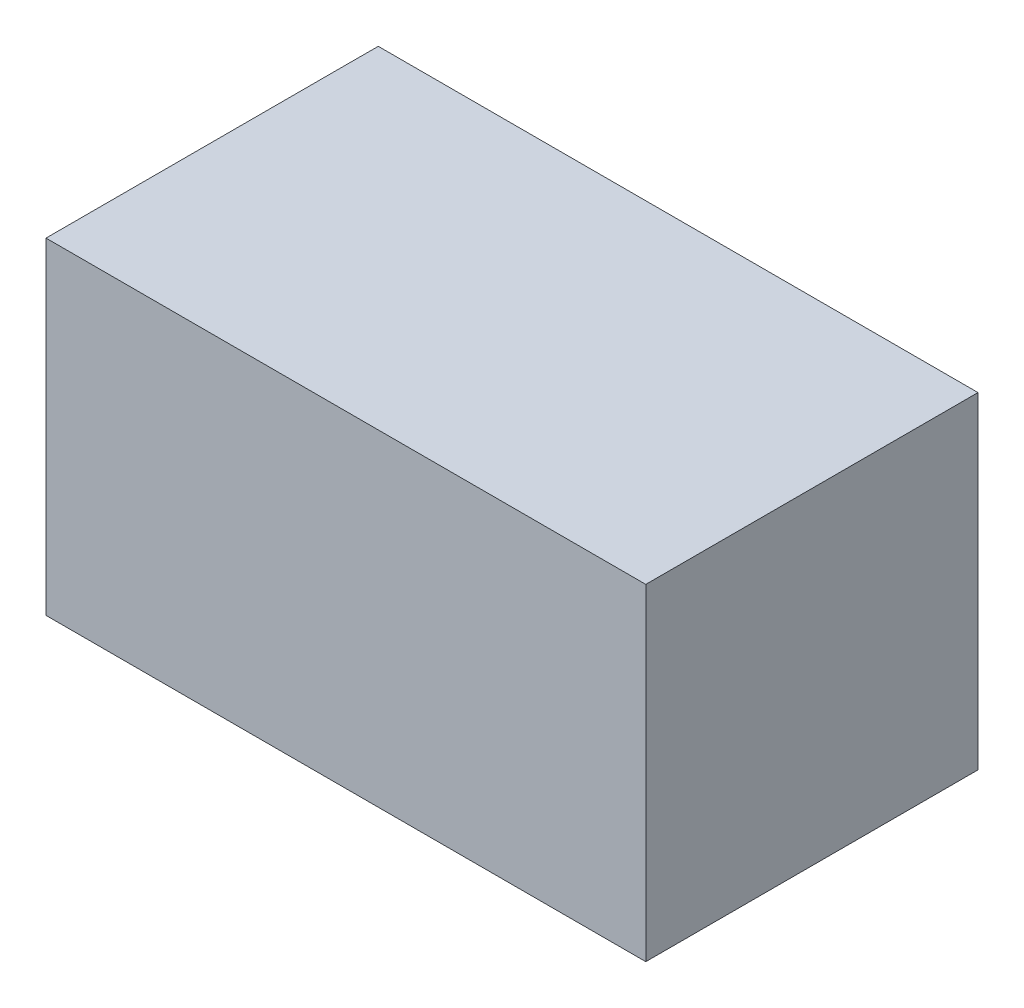
ISO-10303-21;
HEADER;
FILE_DESCRIPTION(('STEP AP214'),'2;1');
FILE_NAME('part.step','',(''),(''),'','','');
FILE_SCHEMA(('AUTOMOTIVE_DESIGN { 1 0 10303 214 1 1 1 1 }'));
ENDSEC;
DATA;
#1=APPLICATION_CONTEXT('core data for automotive mechanical design processes');
#2=APPLICATION_PROTOCOL_DEFINITION('international standard','automotive_design',2000,#1);
#3=PRODUCT_CONTEXT('',#1,'mechanical');
#4=PRODUCT('Part','Part','',(#3));
#5=PRODUCT_RELATED_PRODUCT_CATEGORY('part','',(#4));
#6=PRODUCT_DEFINITION_FORMATION('','',#4);
#7=PRODUCT_DEFINITION_CONTEXT('part definition',#1,'design');
#8=PRODUCT_DEFINITION('design','',#6,#7);
#9=PRODUCT_DEFINITION_SHAPE('','',#8);
#10=(LENGTH_UNIT() NAMED_UNIT(*) SI_UNIT(.MILLI.,.METRE.));
#11=(NAMED_UNIT(*) PLANE_ANGLE_UNIT() SI_UNIT($,.RADIAN.));
#12=(NAMED_UNIT(*) SI_UNIT($,.STERADIAN.) SOLID_ANGLE_UNIT());
#13=UNCERTAINTY_MEASURE_WITH_UNIT(LENGTH_MEASURE(1.E-05),#10,'distance_accuracy_value','');
#14=(GEOMETRIC_REPRESENTATION_CONTEXT(3) GLOBAL_UNCERTAINTY_ASSIGNED_CONTEXT((#13)) GLOBAL_UNIT_ASSIGNED_CONTEXT((#10,
#11,#12)) REPRESENTATION_CONTEXT('',''));
#15=CARTESIAN_POINT('',(0.,0.,0.));
#16=DIRECTION('',(0.,0.,1.));
#17=DIRECTION('',(1.,0.,0.));
#18=AXIS2_PLACEMENT_3D('',#15,#16,#17);
#19=CARTESIAN_POINT('',(0.,0.,0.));
#20=DIRECTION('',(0.,0.,1.));
#21=DIRECTION('',(1.,0.,0.));
#22=AXIS2_PLACEMENT_3D('',#19,#20,#21);
#23=PLANE('',#22);
#24=DIRECTION('',(1.,0.,0.));
#25=VECTOR('',#24,1.);
#26=CARTESIAN_POINT('',(-41.,-15.,0.));
#27=LINE('',#26,#25);
#28=CARTESIAN_POINT('',(-14.06,-15.,0.));
#29=VERTEX_POINT('',#28);
#30=CARTESIAN_POINT('',(41.,-15.,0.));
#31=VERTEX_POINT('',#30);
#32=EDGE_CURVE('E141',#29,#31,#27,.T.);
#33=ORIENTED_EDGE('',*,*,#32,.F.);
#34=DIRECTION('',(0.,1.,0.));
#35=VECTOR('',#34,1.);
#36=CARTESIAN_POINT('',(-14.06,0.,0.));
#37=LINE('',#36,#35);
#38=CARTESIAN_POINT('',(-14.06,15.,0.));
#39=VERTEX_POINT('',#38);
#40=EDGE_CURVE('E132',#29,#39,#37,.T.);
#41=ORIENTED_EDGE('',*,*,#40,.T.);
#42=DIRECTION('',(-1.,0.,0.));
#43=VECTOR('',#42,1.);
#44=CARTESIAN_POINT('',(-41.,15.,0.));
#45=LINE('',#44,#43);
#46=CARTESIAN_POINT('',(41.,15.,0.));
#47=VERTEX_POINT('',#46);
#48=EDGE_CURVE('E217',#47,#39,#45,.T.);
#49=ORIENTED_EDGE('',*,*,#48,.F.);
#50=DIRECTION('',(0.,1.,0.));
#51=VECTOR('',#50,1.);
#52=CARTESIAN_POINT('',(41.,15.,0.));
#53=LINE('',#52,#51);
#54=EDGE_CURVE('E136',#31,#47,#53,.T.);
#55=ORIENTED_EDGE('',*,*,#54,.F.);
#56=EDGE_LOOP('',(#33,#41,#49,#55));
#57=FACE_BOUND('',#56,.T.);
#58=ADVANCED_FACE('F47',(#57),#23,.F.);
#59=CARTESIAN_POINT('',(41.,15.,1.5));
#60=DIRECTION('',(-1.,0.,0.));
#61=DIRECTION('',(0.,0.,1.));
#62=AXIS2_PLACEMENT_3D('',#59,#60,#61);
#63=PLANE('',#62);
#64=ORIENTED_EDGE('',*,*,#54,.T.);
#65=DIRECTION('',(0.,0.,-1.));
#66=VECTOR('',#65,1.);
#67=CARTESIAN_POINT('',(41.,15.,1.5));
#68=LINE('',#67,#66);
#69=CARTESIAN_POINT('',(41.,15.,30.5));
#70=VERTEX_POINT('',#69);
#71=EDGE_CURVE('E211',#70,#47,#68,.T.);
#72=ORIENTED_EDGE('',*,*,#71,.F.);
#73=DIRECTION('',(0.,1.,0.));
#74=VECTOR('',#73,1.);
#75=CARTESIAN_POINT('',(41.,15.,30.5));
#76=LINE('',#75,#74);
#77=CARTESIAN_POINT('',(41.,-15.,30.5));
#78=VERTEX_POINT('',#77);
#79=EDGE_CURVE('E145',#78,#70,#76,.T.);
#80=ORIENTED_EDGE('',*,*,#79,.F.);
#81=DIRECTION('',(0.,0.,-1.));
#82=VECTOR('',#81,1.);
#83=CARTESIAN_POINT('',(41.,-15.,1.5));
#84=LINE('',#83,#82);
#85=EDGE_CURVE('E131',#78,#31,#84,.T.);
#86=ORIENTED_EDGE('',*,*,#85,.T.);
#87=EDGE_LOOP('',(#64,#72,#80,#86));
#88=FACE_BOUND('',#87,.T.);
#89=ADVANCED_FACE('F287',(#88),#63,.F.);
#90=CARTESIAN_POINT('',(-41.,15.,1.5));
#91=DIRECTION('',(0.,-1.,0.));
#92=DIRECTION('',(0.,0.,-1.));
#93=AXIS2_PLACEMENT_3D('',#90,#91,#92);
#94=PLANE('',#93);
#95=DIRECTION('',(0.,0.,1.));
#96=VECTOR('',#95,1.);
#97=CARTESIAN_POINT('',(-14.06,15.,1.5));
#98=LINE('',#97,#96);
#99=CARTESIAN_POINT('',(-14.06,15.,1.5));
#100=VERTEX_POINT('',#99);
#101=EDGE_CURVE('E128',#39,#100,#98,.T.);
#102=ORIENTED_EDGE('',*,*,#101,.T.);
#103=DIRECTION('',(-1.,0.,0.));
#104=VECTOR('',#103,1.);
#105=CARTESIAN_POINT('',(-41.,15.,1.5));
#106=LINE('',#105,#104);
#107=CARTESIAN_POINT('',(-14.0640967757307,15.,1.5));
#108=VERTEX_POINT('',#107);
#109=EDGE_CURVE('E113',#100,#108,#106,.T.);
#110=ORIENTED_EDGE('',*,*,#109,.T.);
#111=DIRECTION('',(0.,0.,-1.));
#112=VECTOR('',#111,1.);
#113=CARTESIAN_POINT('',(-14.0640967757307,15.,30.5));
#114=LINE('',#113,#112);
#115=CARTESIAN_POINT('',(-14.0640967757307,15.,30.5));
#116=VERTEX_POINT('',#115);
#117=EDGE_CURVE('E173',#116,#108,#114,.T.);
#118=ORIENTED_EDGE('',*,*,#117,.F.);
#119=DIRECTION('',(-1.,0.,0.));
#120=VECTOR('',#119,1.);
#121=CARTESIAN_POINT('',(-14.0640967757307,15.,30.5));
#122=LINE('',#121,#120);
#123=EDGE_CURVE('E170',#70,#116,#122,.T.);
#124=ORIENTED_EDGE('',*,*,#123,.F.);
#125=ORIENTED_EDGE('',*,*,#71,.T.);
#126=ORIENTED_EDGE('',*,*,#48,.T.);
#127=EDGE_LOOP('',(#102,#110,#118,#124,#125,#126));
#128=FACE_BOUND('',#127,.T.);
#129=ADVANCED_FACE('F289',(#128),#94,.F.);
#130=CARTESIAN_POINT('',(-41.,-15.,1.5));
#131=DIRECTION('',(0.,1.,0.));
#132=DIRECTION('',(0.,0.,1.));
#133=AXIS2_PLACEMENT_3D('',#130,#131,#132);
#134=PLANE('',#133);
#135=DIRECTION('',(0.,0.,-1.));
#136=VECTOR('',#135,1.);
#137=CARTESIAN_POINT('',(-14.0640967757307,-15.,30.5));
#138=LINE('',#137,#136);
#139=CARTESIAN_POINT('',(-14.0640967757307,-15.,30.5));
#140=VERTEX_POINT('',#139);
#141=CARTESIAN_POINT('',(-14.0640967757307,-15.,1.5));
#142=VERTEX_POINT('',#141);
#143=EDGE_CURVE('E213',#140,#142,#138,.T.);
#144=ORIENTED_EDGE('',*,*,#143,.T.);
#145=DIRECTION('',(1.,0.,0.));
#146=VECTOR('',#145,1.);
#147=CARTESIAN_POINT('',(-41.,-15.,1.5));
#148=LINE('',#147,#146);
#149=CARTESIAN_POINT('',(-14.06,-15.,1.5));
#150=VERTEX_POINT('',#149);
#151=EDGE_CURVE('E65',#142,#150,#148,.T.);
#152=ORIENTED_EDGE('',*,*,#151,.T.);
#153=DIRECTION('',(0.,0.,-1.));
#154=VECTOR('',#153,1.);
#155=CARTESIAN_POINT('',(-14.06,-15.,1.5));
#156=LINE('',#155,#154);
#157=EDGE_CURVE('E137',#150,#29,#156,.T.);
#158=ORIENTED_EDGE('',*,*,#157,.T.);
#159=ORIENTED_EDGE('',*,*,#32,.T.);
#160=ORIENTED_EDGE('',*,*,#85,.F.);
#161=DIRECTION('',(1.,0.,0.));
#162=VECTOR('',#161,1.);
#163=CARTESIAN_POINT('',(41.,-15.,30.5));
#164=LINE('',#163,#162);
#165=EDGE_CURVE('E152',#140,#78,#164,.T.);
#166=ORIENTED_EDGE('',*,*,#165,.F.);
#167=EDGE_LOOP('',(#144,#152,#158,#159,#160,#166));
#168=FACE_BOUND('',#167,.T.);
#169=ADVANCED_FACE('F282',(#168),#134,.F.);
#170=CARTESIAN_POINT('',(-14.0640967757307,-15.,30.5));
#171=DIRECTION('',(1.,0.,0.));
#172=DIRECTION('',(0.,0.,-1.));
#173=AXIS2_PLACEMENT_3D('',#170,#171,#172);
#174=PLANE('',#173);
#175=DIRECTION('',(0.,-1.,0.));
#176=VECTOR('',#175,1.);
#177=CARTESIAN_POINT('',(-14.0640967757307,-15.,1.5));
#178=LINE('',#177,#176);
#179=CARTESIAN_POINT('',(-14.0640967757307,14.0374053382993,1.5));
#180=VERTEX_POINT('',#179);
#181=EDGE_CURVE('E164',#108,#180,#178,.T.);
#182=ORIENTED_EDGE('',*,*,#181,.T.);
#183=DIRECTION('',(0.,0.,-1.));
#184=VECTOR('',#183,1.);
#185=CARTESIAN_POINT('',(-14.0640967757307,14.0374053382993,2.81738964945669));
#186=LINE('',#185,#184);
#187=CARTESIAN_POINT('',(-14.0640967757307,14.0374053382993,29.1700650063779));
#188=VERTEX_POINT('',#187);
#189=EDGE_CURVE('E117',#188,#180,#186,.T.);
#190=ORIENTED_EDGE('',*,*,#189,.F.);
#191=DIRECTION('',(0.,1.,0.));
#192=VECTOR('',#191,1.);
#193=CARTESIAN_POINT('',(-14.0640967757307,14.0374053382993,29.1700650063779));
#194=LINE('',#193,#192);
#195=CARTESIAN_POINT('',(-14.0640967757307,-14.1575543140905,29.1700650063779));
#196=VERTEX_POINT('',#195);
#197=EDGE_CURVE('E179',#196,#188,#194,.T.);
#198=ORIENTED_EDGE('',*,*,#197,.F.);
#199=DIRECTION('',(0.,0.,1.));
#200=VECTOR('',#199,1.);
#201=CARTESIAN_POINT('',(-14.0640967757307,-14.1575543140905,29.1700650063779));
#202=LINE('',#201,#200);
#203=CARTESIAN_POINT('',(-14.0640967757307,-14.1575543140905,1.5));
#204=VERTEX_POINT('',#203);
#205=EDGE_CURVE('E122',#204,#196,#202,.T.);
#206=ORIENTED_EDGE('',*,*,#205,.F.);
#207=EDGE_CURVE('E227',#204,#142,#178,.T.);
#208=ORIENTED_EDGE('',*,*,#207,.T.);
#209=ORIENTED_EDGE('',*,*,#143,.F.);
#210=DIRECTION('',(0.,-1.,0.));
#211=VECTOR('',#210,1.);
#212=CARTESIAN_POINT('',(-14.0640967757307,-15.,30.5));
#213=LINE('',#212,#211);
#214=EDGE_CURVE('E161',#116,#140,#213,.T.);
#215=ORIENTED_EDGE('',*,*,#214,.F.);
#216=ORIENTED_EDGE('',*,*,#117,.T.);
#217=EDGE_LOOP('',(#182,#190,#198,#206,#208,#209,#215,#216));
#218=FACE_BOUND('',#217,.T.);
#219=ADVANCED_FACE('F293',(#218),#174,.F.);
#220=CARTESIAN_POINT('',(0.,0.,30.5));
#221=DIRECTION('',(0.,0.,-1.));
#222=DIRECTION('',(-1.,0.,0.));
#223=AXIS2_PLACEMENT_3D('',#220,#221,#222);
#224=PLANE('',#223);
#225=ORIENTED_EDGE('',*,*,#123,.T.);
#226=ORIENTED_EDGE('',*,*,#214,.T.);
#227=ORIENTED_EDGE('',*,*,#165,.T.);
#228=ORIENTED_EDGE('',*,*,#79,.T.);
#229=EDGE_LOOP('',(#225,#226,#227,#228));
#230=FACE_BOUND('',#229,.T.);
#231=ADVANCED_FACE('F291',(#230),#224,.F.);
#232=CARTESIAN_POINT('',(38.9359032242693,-14.1575543140905,29.1700650063779));
#233=DIRECTION('',(0.,-1.,0.));
#234=DIRECTION('',(0.,0.,-1.));
#235=AXIS2_PLACEMENT_3D('',#232,#233,#234);
#236=PLANE('',#235);
#237=DIRECTION('',(0.,0.,1.));
#238=VECTOR('',#237,1.);
#239=CARTESIAN_POINT('',(-14.06,-14.1575543140905,29.1700650063779));
#240=LINE('',#239,#238);
#241=CARTESIAN_POINT('',(-14.06,-14.1575543140905,1.49738964945669));
#242=VERTEX_POINT('',#241);
#243=CARTESIAN_POINT('',(-14.06,-14.1575543140905,1.5));
#244=VERTEX_POINT('',#243);
#245=EDGE_CURVE('E142',#242,#244,#240,.T.);
#246=ORIENTED_EDGE('',*,*,#245,.T.);
#247=DIRECTION('',(-1.,0.,0.));
#248=VECTOR('',#247,1.);
#249=CARTESIAN_POINT('',(38.9359032242693,-14.1575543140905,1.5));
#250=LINE('',#249,#248);
#251=EDGE_CURVE('E126',#244,#204,#250,.T.);
#252=ORIENTED_EDGE('',*,*,#251,.T.);
#253=ORIENTED_EDGE('',*,*,#205,.T.);
#254=DIRECTION('',(-1.,0.,0.));
#255=VECTOR('',#254,1.);
#256=CARTESIAN_POINT('',(38.9359032242693,-14.1575543140905,29.1700650063779));
#257=LINE('',#256,#255);
#258=CARTESIAN_POINT('',(38.9359032242693,-14.1575543140905,29.1700650063779));
#259=VERTEX_POINT('',#258);
#260=EDGE_CURVE('E174',#259,#196,#257,.T.);
#261=ORIENTED_EDGE('',*,*,#260,.F.);
#262=DIRECTION('',(0.,0.,1.));
#263=VECTOR('',#262,1.);
#264=CARTESIAN_POINT('',(38.9359032242693,-14.1575543140905,29.1700650063779));
#265=LINE('',#264,#263);
#266=CARTESIAN_POINT('',(38.9359032242693,-14.1575543140905,1.49738964945669));
#267=VERTEX_POINT('',#266);
#268=EDGE_CURVE('E178',#267,#259,#265,.T.);
#269=ORIENTED_EDGE('',*,*,#268,.F.);
#270=DIRECTION('',(1.,0.,0.));
#271=VECTOR('',#270,1.);
#272=CARTESIAN_POINT('',(38.9359032242693,-14.1575543140905,1.49738964945669));
#273=LINE('',#272,#271);
#274=EDGE_CURVE('E206',#242,#267,#273,.T.);
#275=ORIENTED_EDGE('',*,*,#274,.F.);
#276=EDGE_LOOP('',(#246,#252,#253,#261,#269,#275));
#277=FACE_BOUND('',#276,.T.);
#278=ADVANCED_FACE('F245',(#277),#236,.F.);
#279=CARTESIAN_POINT('',(38.9359032242693,14.0374053382993,2.81738964945669));
#280=DIRECTION('',(0.,1.,0.));
#281=DIRECTION('',(0.,0.,1.));
#282=AXIS2_PLACEMENT_3D('',#279,#280,#281);
#283=PLANE('',#282);
#284=ORIENTED_EDGE('',*,*,#189,.T.);
#285=DIRECTION('',(1.,0.,0.));
#286=VECTOR('',#285,1.);
#287=CARTESIAN_POINT('',(38.9359032242693,14.0374053382993,1.5));
#288=LINE('',#287,#286);
#289=CARTESIAN_POINT('',(-14.06,14.0374053382993,1.5));
#290=VERTEX_POINT('',#289);
#291=EDGE_CURVE('E107',#180,#290,#288,.T.);
#292=ORIENTED_EDGE('',*,*,#291,.T.);
#293=DIRECTION('',(0.,0.,-1.));
#294=VECTOR('',#293,1.);
#295=CARTESIAN_POINT('',(-14.06,14.0374053382993,2.81738964945669));
#296=LINE('',#295,#294);
#297=CARTESIAN_POINT('',(-14.06,14.0374053382993,1.49738964945669));
#298=VERTEX_POINT('',#297);
#299=EDGE_CURVE('E95',#290,#298,#296,.T.);
#300=ORIENTED_EDGE('',*,*,#299,.T.);
#301=DIRECTION('',(-1.,0.,0.));
#302=VECTOR('',#301,1.);
#303=CARTESIAN_POINT('',(-14.0640967757307,14.0374053382993,1.49738964945669));
#304=LINE('',#303,#302);
#305=CARTESIAN_POINT('',(38.9359032242693,14.0374053382993,1.49738964945669));
#306=VERTEX_POINT('',#305);
#307=EDGE_CURVE('E192',#306,#298,#304,.T.);
#308=ORIENTED_EDGE('',*,*,#307,.F.);
#309=DIRECTION('',(0.,0.,-1.));
#310=VECTOR('',#309,1.);
#311=CARTESIAN_POINT('',(38.9359032242693,14.0374053382993,2.81738964945669));
#312=LINE('',#311,#310);
#313=CARTESIAN_POINT('',(38.9359032242693,14.0374053382993,29.1700650063779));
#314=VERTEX_POINT('',#313);
#315=EDGE_CURVE('E188',#314,#306,#312,.T.);
#316=ORIENTED_EDGE('',*,*,#315,.F.);
#317=DIRECTION('',(-1.,0.,0.));
#318=VECTOR('',#317,1.);
#319=CARTESIAN_POINT('',(38.9359032242693,14.0374053382993,29.1700650063779));
#320=LINE('',#319,#318);
#321=EDGE_CURVE('E106',#314,#188,#320,.T.);
#322=ORIENTED_EDGE('',*,*,#321,.T.);
#323=EDGE_LOOP('',(#284,#292,#300,#308,#316,#322));
#324=FACE_BOUND('',#323,.T.);
#325=ADVANCED_FACE('F114',(#324),#283,.F.);
#326=CARTESIAN_POINT('',(38.9359032242693,14.0374053382993,29.1700650063779));
#327=DIRECTION('',(0.,0.,1.));
#328=DIRECTION('',(1.,0.,0.));
#329=AXIS2_PLACEMENT_3D('',#326,#327,#328);
#330=PLANE('',#329);
#331=ORIENTED_EDGE('',*,*,#197,.T.);
#332=ORIENTED_EDGE('',*,*,#321,.F.);
#333=DIRECTION('',(0.,1.,0.));
#334=VECTOR('',#333,1.);
#335=CARTESIAN_POINT('',(38.9359032242693,14.0374053382993,29.1700650063779));
#336=LINE('',#335,#334);
#337=EDGE_CURVE('E193',#259,#314,#336,.T.);
#338=ORIENTED_EDGE('',*,*,#337,.F.);
#339=ORIENTED_EDGE('',*,*,#260,.T.);
#340=EDGE_LOOP('',(#331,#332,#338,#339));
#341=FACE_BOUND('',#340,.T.);
#342=ADVANCED_FACE('F260',(#341),#330,.F.);
#343=CARTESIAN_POINT('',(38.9359032242693,0.,0.));
#344=DIRECTION('',(-1.,0.,0.));
#345=DIRECTION('',(0.,0.,1.));
#346=AXIS2_PLACEMENT_3D('',#343,#344,#345);
#347=PLANE('',#346);
#348=ORIENTED_EDGE('',*,*,#268,.T.);
#349=ORIENTED_EDGE('',*,*,#337,.T.);
#350=ORIENTED_EDGE('',*,*,#315,.T.);
#351=DIRECTION('',(0.,1.,0.));
#352=VECTOR('',#351,1.);
#353=CARTESIAN_POINT('',(38.9359032242693,14.0374053382993,1.49738964945669));
#354=LINE('',#353,#352);
#355=EDGE_CURVE('E202',#267,#306,#354,.T.);
#356=ORIENTED_EDGE('',*,*,#355,.F.);
#357=EDGE_LOOP('',(#348,#349,#350,#356));
#358=FACE_BOUND('',#357,.T.);
#359=ADVANCED_FACE('F252',(#358),#347,.T.);
#360=CARTESIAN_POINT('',(0.,0.,1.49738964945669));
#361=DIRECTION('',(0.,0.,-1.));
#362=DIRECTION('',(-1.,0.,0.));
#363=AXIS2_PLACEMENT_3D('',#360,#361,#362);
#364=PLANE('',#363);
#365=ORIENTED_EDGE('',*,*,#307,.T.);
#366=DIRECTION('',(0.,-1.,0.));
#367=VECTOR('',#366,1.);
#368=CARTESIAN_POINT('',(-14.06,0.,1.49738964945669));
#369=LINE('',#368,#367);
#370=EDGE_CURVE('E100',#298,#242,#369,.T.);
#371=ORIENTED_EDGE('',*,*,#370,.T.);
#372=ORIENTED_EDGE('',*,*,#274,.T.);
#373=ORIENTED_EDGE('',*,*,#355,.T.);
#374=EDGE_LOOP('',(#365,#371,#372,#373));
#375=FACE_BOUND('',#374,.T.);
#376=ADVANCED_FACE('F242',(#375),#364,.F.);
#377=CARTESIAN_POINT('',(-14.06,0.,0.));
#378=DIRECTION('',(1.,0.,0.));
#379=DIRECTION('',(0.,0.,-1.));
#380=AXIS2_PLACEMENT_3D('',#377,#378,#379);
#381=PLANE('',#380);
#382=ORIENTED_EDGE('',*,*,#40,.F.);
#383=ORIENTED_EDGE('',*,*,#157,.F.);
#384=DIRECTION('',(0.,1.,0.));
#385=VECTOR('',#384,1.);
#386=CARTESIAN_POINT('',(-14.06,16.2401365611424,1.5));
#387=LINE('',#386,#385);
#388=EDGE_CURVE('E57',#150,#244,#387,.T.);
#389=ORIENTED_EDGE('',*,*,#388,.T.);
#390=ORIENTED_EDGE('',*,*,#245,.F.);
#391=ORIENTED_EDGE('',*,*,#370,.F.);
#392=ORIENTED_EDGE('',*,*,#299,.F.);
#393=EDGE_CURVE('E11',#290,#100,#387,.T.);
#394=ORIENTED_EDGE('',*,*,#393,.T.);
#395=ORIENTED_EDGE('',*,*,#101,.F.);
#396=EDGE_LOOP('',(#382,#383,#389,#390,#391,#392,#394,#395));
#397=FACE_BOUND('',#396,.T.);
#398=ADVANCED_FACE('F49',(#397),#381,.F.);
#399=CARTESIAN_POINT('',(-14.06,15.,1.5));
#400=DIRECTION('',(0.,0.,1.));
#401=DIRECTION('',(1.,0.,0.));
#402=AXIS2_PLACEMENT_3D('',#399,#400,#401);
#403=PLANE('',#402);
#404=ORIENTED_EDGE('',*,*,#393,.F.);
#405=ORIENTED_EDGE('',*,*,#291,.F.);
#406=ORIENTED_EDGE('',*,*,#181,.F.);
#407=ORIENTED_EDGE('',*,*,#109,.F.);
#408=EDGE_LOOP('',(#404,#405,#406,#407));
#409=FACE_BOUND('',#408,.T.);
#410=ADVANCED_FACE('F109',(#409),#403,.F.);
#411=ORIENTED_EDGE('',*,*,#207,.F.);
#412=ORIENTED_EDGE('',*,*,#251,.F.);
#413=ORIENTED_EDGE('',*,*,#388,.F.);
#414=ORIENTED_EDGE('',*,*,#151,.F.);
#415=EDGE_LOOP('',(#411,#412,#413,#414));
#416=FACE_BOUND('',#415,.T.);
#417=ADVANCED_FACE('F298',(#416),#403,.F.);
#418=CLOSED_SHELL('',(#58,#89,#129,#169,#219,#231,#278,#325,#342,#359,#376,#398,#410,#417));
#419=MANIFOLD_SOLID_BREP('B2',#418);
#420=ADVANCED_BREP_SHAPE_REPRESENTATION('',(#18,#419),#14);
#421=SHAPE_DEFINITION_REPRESENTATION(#9,#420);
ENDSEC;
END-ISO-10303-21;
